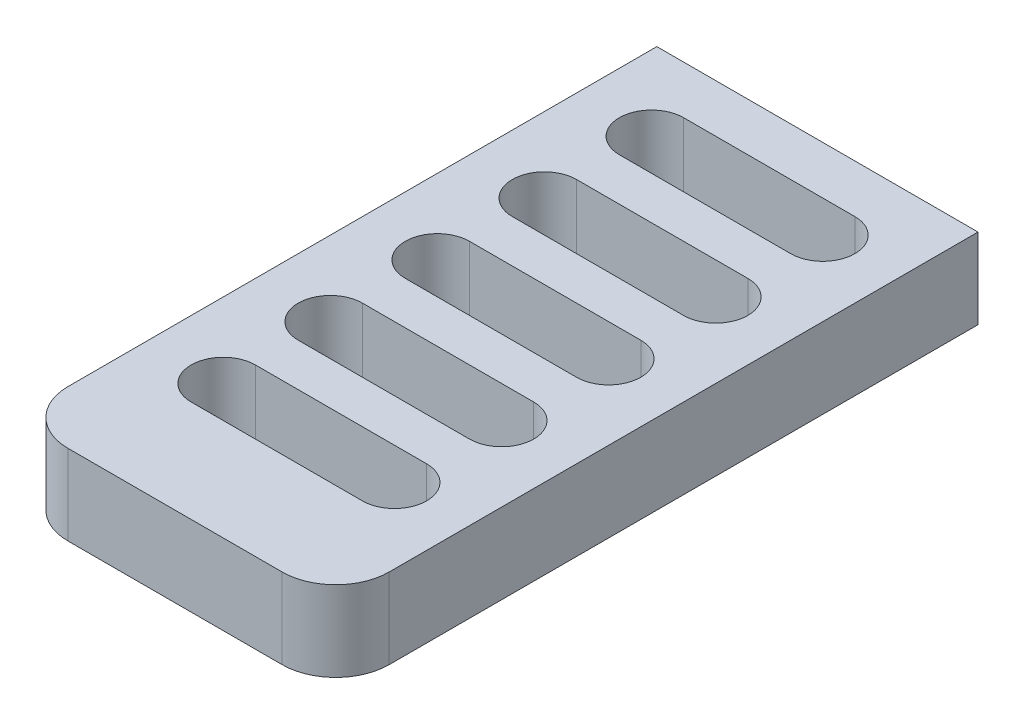
ISO-10303-21;
HEADER;
FILE_DESCRIPTION(('STEP AP214'),'2;1');
FILE_NAME('part.step','',(''),(''),'','','');
FILE_SCHEMA(('AUTOMOTIVE_DESIGN { 1 0 10303 214 1 1 1 1 }'));
ENDSEC;
DATA;
#1=APPLICATION_CONTEXT('core data for automotive mechanical design processes');
#2=APPLICATION_PROTOCOL_DEFINITION('international standard','automotive_design',2000,#1);
#3=PRODUCT_CONTEXT('',#1,'mechanical');
#4=PRODUCT('Part','Part','',(#3));
#5=PRODUCT_RELATED_PRODUCT_CATEGORY('part','',(#4));
#6=PRODUCT_DEFINITION_FORMATION('','',#4);
#7=PRODUCT_DEFINITION_CONTEXT('part definition',#1,'design');
#8=PRODUCT_DEFINITION('design','',#6,#7);
#9=PRODUCT_DEFINITION_SHAPE('','',#8);
#10=(LENGTH_UNIT() NAMED_UNIT(*) SI_UNIT(.MILLI.,.METRE.));
#11=(NAMED_UNIT(*) PLANE_ANGLE_UNIT() SI_UNIT($,.RADIAN.));
#12=(NAMED_UNIT(*) SI_UNIT($,.STERADIAN.) SOLID_ANGLE_UNIT());
#13=UNCERTAINTY_MEASURE_WITH_UNIT(LENGTH_MEASURE(1.E-05),#10,'distance_accuracy_value','');
#14=(GEOMETRIC_REPRESENTATION_CONTEXT(3) GLOBAL_UNCERTAINTY_ASSIGNED_CONTEXT((#13)) GLOBAL_UNIT_ASSIGNED_CONTEXT((#10,
#11,#12)) REPRESENTATION_CONTEXT('',''));
#15=CARTESIAN_POINT('',(0.,0.,0.));
#16=DIRECTION('',(0.,0.,1.));
#17=DIRECTION('',(1.,0.,0.));
#18=AXIS2_PLACEMENT_3D('',#15,#16,#17);
#19=CARTESIAN_POINT('',(10.,15.,-10.));
#20=DIRECTION('',(0.,-1.,0.));
#21=DIRECTION('',(0.,0.,-1.));
#22=AXIS2_PLACEMENT_3D('',#19,#20,#21);
#23=PLANE('',#22);
#24=CARTESIAN_POINT('',(14.,15.,-45.));
#25=DIRECTION('',(0.,1.,0.));
#26=DIRECTION('',(0.,0.,1.));
#27=AXIS2_PLACEMENT_3D('',#24,#25,#26);
#28=CIRCLE('',#27,6.00000000000001);
#29=CARTESIAN_POINT('',(14.,15.,-51.));
#30=VERTEX_POINT('',#29);
#31=CARTESIAN_POINT('',(14.,15.,-39.));
#32=VERTEX_POINT('',#31);
#33=EDGE_CURVE('E246',#30,#32,#28,.T.);
#34=ORIENTED_EDGE('',*,*,#33,.F.);
#35=DIRECTION('',(-1.,0.,0.));
#36=VECTOR('',#35,1.);
#37=CARTESIAN_POINT('',(14.,15.,-51.));
#38=LINE('',#37,#36);
#39=CARTESIAN_POINT('',(46.,15.,-51.));
#40=VERTEX_POINT('',#39);
#41=EDGE_CURVE('E254',#40,#30,#38,.T.);
#42=ORIENTED_EDGE('',*,*,#41,.F.);
#43=CARTESIAN_POINT('',(46.,15.,-45.));
#44=DIRECTION('',(0.,1.,0.));
#45=DIRECTION('',(0.,0.,1.));
#46=AXIS2_PLACEMENT_3D('',#43,#44,#45);
#47=CIRCLE('',#46,6.00000000000001);
#48=CARTESIAN_POINT('',(46.,15.,-39.));
#49=VERTEX_POINT('',#48);
#50=EDGE_CURVE('E251',#49,#40,#47,.T.);
#51=ORIENTED_EDGE('',*,*,#50,.F.);
#52=DIRECTION('',(1.,0.,0.));
#53=VECTOR('',#52,1.);
#54=CARTESIAN_POINT('',(14.,15.,-39.));
#55=LINE('',#54,#53);
#56=EDGE_CURVE('E248',#32,#49,#55,.T.);
#57=ORIENTED_EDGE('',*,*,#56,.F.);
#58=EDGE_LOOP('',(#34,#42,#51,#57));
#59=FACE_BOUND('',#58,.T.);
#60=CARTESIAN_POINT('',(14.,15.,-85.));
#61=DIRECTION('',(0.,1.,0.));
#62=DIRECTION('',(0.,0.,1.));
#63=AXIS2_PLACEMENT_3D('',#60,#61,#62);
#64=CIRCLE('',#63,6.00000000000001);
#65=CARTESIAN_POINT('',(14.,15.,-91.));
#66=VERTEX_POINT('',#65);
#67=CARTESIAN_POINT('',(14.,15.,-79.));
#68=VERTEX_POINT('',#67);
#69=EDGE_CURVE('E308',#66,#68,#64,.T.);
#70=ORIENTED_EDGE('',*,*,#69,.F.);
#71=DIRECTION('',(-1.,0.,0.));
#72=VECTOR('',#71,1.);
#73=CARTESIAN_POINT('',(14.,15.,-91.));
#74=LINE('',#73,#72);
#75=CARTESIAN_POINT('',(46.,15.,-91.));
#76=VERTEX_POINT('',#75);
#77=EDGE_CURVE('E316',#76,#66,#74,.T.);
#78=ORIENTED_EDGE('',*,*,#77,.F.);
#79=CARTESIAN_POINT('',(46.,15.,-85.));
#80=DIRECTION('',(0.,1.,0.));
#81=DIRECTION('',(0.,0.,1.));
#82=AXIS2_PLACEMENT_3D('',#79,#80,#81);
#83=CIRCLE('',#82,6.00000000000001);
#84=CARTESIAN_POINT('',(46.,15.,-79.));
#85=VERTEX_POINT('',#84);
#86=EDGE_CURVE('E313',#85,#76,#83,.T.);
#87=ORIENTED_EDGE('',*,*,#86,.F.);
#88=DIRECTION('',(1.,0.,0.));
#89=VECTOR('',#88,1.);
#90=CARTESIAN_POINT('',(14.,15.,-79.));
#91=LINE('',#90,#89);
#92=EDGE_CURVE('E310',#68,#85,#91,.T.);
#93=ORIENTED_EDGE('',*,*,#92,.F.);
#94=EDGE_LOOP('',(#70,#78,#87,#93));
#95=FACE_BOUND('',#94,.T.);
#96=DIRECTION('',(0.,0.,-1.));
#97=VECTOR('',#96,1.);
#98=CARTESIAN_POINT('',(60.,15.,-10.0000000000001));
#99=LINE('',#98,#97);
#100=CARTESIAN_POINT('',(60.,15.,-10.0000000000001));
#101=VERTEX_POINT('',#100);
#102=CARTESIAN_POINT('',(60.,15.,-120.));
#103=VERTEX_POINT('',#102);
#104=EDGE_CURVE('E370',#101,#103,#99,.T.);
#105=ORIENTED_EDGE('',*,*,#104,.T.);
#106=DIRECTION('',(-1.,0.,0.));
#107=VECTOR('',#106,1.);
#108=CARTESIAN_POINT('',(0.,15.,-120.));
#109=LINE('',#108,#107);
#110=CARTESIAN_POINT('',(0.,15.,-120.));
#111=VERTEX_POINT('',#110);
#112=EDGE_CURVE('E373',#103,#111,#109,.T.);
#113=ORIENTED_EDGE('',*,*,#112,.T.);
#114=DIRECTION('',(0.,0.,1.));
#115=VECTOR('',#114,1.);
#116=CARTESIAN_POINT('',(0.,15.,-10.0000000000001));
#117=LINE('',#116,#115);
#118=CARTESIAN_POINT('',(0.,15.,-10.0000000000001));
#119=VERTEX_POINT('',#118);
#120=EDGE_CURVE('E376',#111,#119,#117,.T.);
#121=ORIENTED_EDGE('',*,*,#120,.T.);
#122=CARTESIAN_POINT('',(10.,15.,-10.));
#123=DIRECTION('',(0.,1.,0.));
#124=DIRECTION('',(0.,0.,-1.));
#125=AXIS2_PLACEMENT_3D('',#122,#123,#124);
#126=CIRCLE('',#125,10.);
#127=CARTESIAN_POINT('',(10.0000000000001,15.,0.));
#128=VERTEX_POINT('',#127);
#129=EDGE_CURVE('E378',#119,#128,#126,.T.);
#130=ORIENTED_EDGE('',*,*,#129,.T.);
#131=DIRECTION('',(1.,0.,0.));
#132=VECTOR('',#131,1.);
#133=CARTESIAN_POINT('',(10.0000000000001,15.,0.));
#134=LINE('',#133,#132);
#135=CARTESIAN_POINT('',(49.9999999999999,15.,0.));
#136=VERTEX_POINT('',#135);
#137=EDGE_CURVE('E380',#128,#136,#134,.T.);
#138=ORIENTED_EDGE('',*,*,#137,.T.);
#139=CARTESIAN_POINT('',(50.,15.,-10.));
#140=DIRECTION('',(0.,1.,0.));
#141=DIRECTION('',(0.,0.,1.));
#142=AXIS2_PLACEMENT_3D('',#139,#140,#141);
#143=CIRCLE('',#142,10.);
#144=EDGE_CURVE('E382',#136,#101,#143,.T.);
#145=ORIENTED_EDGE('',*,*,#144,.T.);
#146=EDGE_LOOP('',(#105,#113,#121,#130,#138,#145));
#147=FACE_BOUND('',#146,.T.);
#148=CARTESIAN_POINT('',(14.,15.,-105.));
#149=DIRECTION('',(0.,1.,0.));
#150=DIRECTION('',(0.,0.,1.));
#151=AXIS2_PLACEMENT_3D('',#148,#149,#150);
#152=CIRCLE('',#151,6.00000000000001);
#153=CARTESIAN_POINT('',(14.,15.,-111.));
#154=VERTEX_POINT('',#153);
#155=CARTESIAN_POINT('',(14.,15.,-99.));
#156=VERTEX_POINT('',#155);
#157=EDGE_CURVE('E339',#154,#156,#152,.T.);
#158=ORIENTED_EDGE('',*,*,#157,.F.);
#159=DIRECTION('',(-1.,0.,0.));
#160=VECTOR('',#159,1.);
#161=CARTESIAN_POINT('',(14.,15.,-111.));
#162=LINE('',#161,#160);
#163=CARTESIAN_POINT('',(46.,15.,-111.));
#164=VERTEX_POINT('',#163);
#165=EDGE_CURVE('E347',#164,#154,#162,.T.);
#166=ORIENTED_EDGE('',*,*,#165,.F.);
#167=CARTESIAN_POINT('',(46.,15.,-105.));
#168=DIRECTION('',(0.,1.,0.));
#169=DIRECTION('',(0.,0.,1.));
#170=AXIS2_PLACEMENT_3D('',#167,#168,#169);
#171=CIRCLE('',#170,6.00000000000001);
#172=CARTESIAN_POINT('',(46.,15.,-99.));
#173=VERTEX_POINT('',#172);
#174=EDGE_CURVE('E344',#173,#164,#171,.T.);
#175=ORIENTED_EDGE('',*,*,#174,.F.);
#176=DIRECTION('',(1.,0.,0.));
#177=VECTOR('',#176,1.);
#178=CARTESIAN_POINT('',(14.,15.,-99.));
#179=LINE('',#178,#177);
#180=EDGE_CURVE('E341',#156,#173,#179,.T.);
#181=ORIENTED_EDGE('',*,*,#180,.F.);
#182=EDGE_LOOP('',(#158,#166,#175,#181));
#183=FACE_BOUND('',#182,.T.);
#184=CARTESIAN_POINT('',(14.,15.,-65.));
#185=DIRECTION('',(0.,1.,0.));
#186=DIRECTION('',(0.,0.,1.));
#187=AXIS2_PLACEMENT_3D('',#184,#185,#186);
#188=CIRCLE('',#187,6.00000000000001);
#189=CARTESIAN_POINT('',(14.,15.,-71.));
#190=VERTEX_POINT('',#189);
#191=CARTESIAN_POINT('',(14.,15.,-59.));
#192=VERTEX_POINT('',#191);
#193=EDGE_CURVE('E277',#190,#192,#188,.T.);
#194=ORIENTED_EDGE('',*,*,#193,.F.);
#195=DIRECTION('',(-1.,0.,0.));
#196=VECTOR('',#195,1.);
#197=CARTESIAN_POINT('',(14.,15.,-71.));
#198=LINE('',#197,#196);
#199=CARTESIAN_POINT('',(46.,15.,-71.));
#200=VERTEX_POINT('',#199);
#201=EDGE_CURVE('E285',#200,#190,#198,.T.);
#202=ORIENTED_EDGE('',*,*,#201,.F.);
#203=CARTESIAN_POINT('',(46.,15.,-65.));
#204=DIRECTION('',(0.,1.,0.));
#205=DIRECTION('',(0.,0.,1.));
#206=AXIS2_PLACEMENT_3D('',#203,#204,#205);
#207=CIRCLE('',#206,6.);
#208=CARTESIAN_POINT('',(46.,15.,-59.));
#209=VERTEX_POINT('',#208);
#210=EDGE_CURVE('E282',#209,#200,#207,.T.);
#211=ORIENTED_EDGE('',*,*,#210,.F.);
#212=DIRECTION('',(1.,0.,0.));
#213=VECTOR('',#212,1.);
#214=CARTESIAN_POINT('',(14.,15.,-59.));
#215=LINE('',#214,#213);
#216=EDGE_CURVE('E279',#192,#209,#215,.T.);
#217=ORIENTED_EDGE('',*,*,#216,.F.);
#218=EDGE_LOOP('',(#194,#202,#211,#217));
#219=FACE_BOUND('',#218,.T.);
#220=CARTESIAN_POINT('',(14.,15.,-25.));
#221=DIRECTION('',(0.,1.,0.));
#222=DIRECTION('',(0.,0.,1.));
#223=AXIS2_PLACEMENT_3D('',#220,#221,#222);
#224=CIRCLE('',#223,6.00000000000001);
#225=CARTESIAN_POINT('',(14.,15.,-31.));
#226=VERTEX_POINT('',#225);
#227=CARTESIAN_POINT('',(14.,15.,-19.));
#228=VERTEX_POINT('',#227);
#229=EDGE_CURVE('E210',#226,#228,#224,.T.);
#230=ORIENTED_EDGE('',*,*,#229,.F.);
#231=DIRECTION('',(-1.,0.,0.));
#232=VECTOR('',#231,1.);
#233=CARTESIAN_POINT('',(14.,15.,-31.));
#234=LINE('',#233,#232);
#235=CARTESIAN_POINT('',(46.,15.,-31.));
#236=VERTEX_POINT('',#235);
#237=EDGE_CURVE('E232',#236,#226,#234,.T.);
#238=ORIENTED_EDGE('',*,*,#237,.F.);
#239=CARTESIAN_POINT('',(46.,15.,-25.));
#240=DIRECTION('',(0.,1.,0.));
#241=DIRECTION('',(0.,0.,1.));
#242=AXIS2_PLACEMENT_3D('',#239,#240,#241);
#243=CIRCLE('',#242,6.00000000000001);
#244=CARTESIAN_POINT('',(46.,15.,-19.));
#245=VERTEX_POINT('',#244);
#246=EDGE_CURVE('E230',#245,#236,#243,.T.);
#247=ORIENTED_EDGE('',*,*,#246,.F.);
#248=DIRECTION('',(1.,0.,0.));
#249=VECTOR('',#248,1.);
#250=CARTESIAN_POINT('',(14.,15.,-19.));
#251=LINE('',#250,#249);
#252=EDGE_CURVE('E218',#228,#245,#251,.T.);
#253=ORIENTED_EDGE('',*,*,#252,.F.);
#254=EDGE_LOOP('',(#230,#238,#247,#253));
#255=FACE_BOUND('',#254,.T.);
#256=ADVANCED_FACE('F37',(#59,#95,#147,#183,#219,#255),#23,.F.);
#257=CARTESIAN_POINT('',(10.,0.,-10.));
#258=DIRECTION('',(0.,-1.,0.));
#259=DIRECTION('',(0.,0.,-1.));
#260=AXIS2_PLACEMENT_3D('',#257,#258,#259);
#261=PLANE('',#260);
#262=DIRECTION('',(0.,0.,-1.));
#263=VECTOR('',#262,1.);
#264=CARTESIAN_POINT('',(60.,0.,-10.0000000000001));
#265=LINE('',#264,#263);
#266=CARTESIAN_POINT('',(60.,0.,-10.0000000000001));
#267=VERTEX_POINT('',#266);
#268=CARTESIAN_POINT('',(60.,0.,-120.));
#269=VERTEX_POINT('',#268);
#270=EDGE_CURVE('E369',#267,#269,#265,.T.);
#271=ORIENTED_EDGE('',*,*,#270,.F.);
#272=CARTESIAN_POINT('',(50.,0.,-10.));
#273=DIRECTION('',(0.,1.,0.));
#274=DIRECTION('',(0.,0.,1.));
#275=AXIS2_PLACEMENT_3D('',#272,#273,#274);
#276=CIRCLE('',#275,10.);
#277=CARTESIAN_POINT('',(49.9999999999999,0.,0.));
#278=VERTEX_POINT('',#277);
#279=EDGE_CURVE('E374',#278,#267,#276,.T.);
#280=ORIENTED_EDGE('',*,*,#279,.F.);
#281=DIRECTION('',(1.,0.,0.));
#282=VECTOR('',#281,1.);
#283=CARTESIAN_POINT('',(10.0000000000001,0.,0.));
#284=LINE('',#283,#282);
#285=CARTESIAN_POINT('',(10.0000000000001,0.,0.));
#286=VERTEX_POINT('',#285);
#287=EDGE_CURVE('E393',#286,#278,#284,.T.);
#288=ORIENTED_EDGE('',*,*,#287,.F.);
#289=CARTESIAN_POINT('',(10.,0.,-10.));
#290=DIRECTION('',(0.,1.,0.));
#291=DIRECTION('',(0.,0.,-1.));
#292=AXIS2_PLACEMENT_3D('',#289,#290,#291);
#293=CIRCLE('',#292,10.);
#294=CARTESIAN_POINT('',(0.,0.,-10.0000000000001));
#295=VERTEX_POINT('',#294);
#296=EDGE_CURVE('E391',#295,#286,#293,.T.);
#297=ORIENTED_EDGE('',*,*,#296,.F.);
#298=DIRECTION('',(0.,0.,1.));
#299=VECTOR('',#298,1.);
#300=CARTESIAN_POINT('',(0.,0.,-10.0000000000001));
#301=LINE('',#300,#299);
#302=CARTESIAN_POINT('',(0.,0.,-120.));
#303=VERTEX_POINT('',#302);
#304=EDGE_CURVE('E389',#303,#295,#301,.T.);
#305=ORIENTED_EDGE('',*,*,#304,.F.);
#306=DIRECTION('',(-1.,0.,0.));
#307=VECTOR('',#306,1.);
#308=CARTESIAN_POINT('',(0.,0.,-120.));
#309=LINE('',#308,#307);
#310=EDGE_CURVE('E387',#269,#303,#309,.T.);
#311=ORIENTED_EDGE('',*,*,#310,.F.);
#312=EDGE_LOOP('',(#271,#280,#288,#297,#305,#311));
#313=FACE_BOUND('',#312,.T.);
#314=DIRECTION('',(-1.,0.,0.));
#315=VECTOR('',#314,1.);
#316=CARTESIAN_POINT('',(14.,0.,-111.));
#317=LINE('',#316,#315);
#318=CARTESIAN_POINT('',(46.,0.,-111.));
#319=VERTEX_POINT('',#318);
#320=CARTESIAN_POINT('',(14.,0.,-111.));
#321=VERTEX_POINT('',#320);
#322=EDGE_CURVE('E342',#319,#321,#317,.T.);
#323=ORIENTED_EDGE('',*,*,#322,.T.);
#324=CARTESIAN_POINT('',(14.,0.,-105.));
#325=DIRECTION('',(0.,1.,0.));
#326=DIRECTION('',(0.,0.,1.));
#327=AXIS2_PLACEMENT_3D('',#324,#325,#326);
#328=CIRCLE('',#327,6.00000000000001);
#329=CARTESIAN_POINT('',(14.,0.,-99.));
#330=VERTEX_POINT('',#329);
#331=EDGE_CURVE('E338',#321,#330,#328,.T.);
#332=ORIENTED_EDGE('',*,*,#331,.T.);
#333=DIRECTION('',(1.,0.,0.));
#334=VECTOR('',#333,1.);
#335=CARTESIAN_POINT('',(14.,0.,-99.));
#336=LINE('',#335,#334);
#337=CARTESIAN_POINT('',(46.,0.,-99.));
#338=VERTEX_POINT('',#337);
#339=EDGE_CURVE('E352',#330,#338,#336,.T.);
#340=ORIENTED_EDGE('',*,*,#339,.T.);
#341=CARTESIAN_POINT('',(46.,0.,-105.));
#342=DIRECTION('',(0.,1.,0.));
#343=DIRECTION('',(0.,0.,1.));
#344=AXIS2_PLACEMENT_3D('',#341,#342,#343);
#345=CIRCLE('',#344,6.00000000000001);
#346=EDGE_CURVE('E355',#338,#319,#345,.T.);
#347=ORIENTED_EDGE('',*,*,#346,.T.);
#348=EDGE_LOOP('',(#323,#332,#340,#347));
#349=FACE_BOUND('',#348,.T.);
#350=DIRECTION('',(-1.,0.,0.));
#351=VECTOR('',#350,1.);
#352=CARTESIAN_POINT('',(14.,0.,-91.));
#353=LINE('',#352,#351);
#354=CARTESIAN_POINT('',(46.,0.,-91.));
#355=VERTEX_POINT('',#354);
#356=CARTESIAN_POINT('',(14.,0.,-91.));
#357=VERTEX_POINT('',#356);
#358=EDGE_CURVE('E311',#355,#357,#353,.T.);
#359=ORIENTED_EDGE('',*,*,#358,.T.);
#360=CARTESIAN_POINT('',(14.,0.,-85.));
#361=DIRECTION('',(0.,1.,0.));
#362=DIRECTION('',(0.,0.,1.));
#363=AXIS2_PLACEMENT_3D('',#360,#361,#362);
#364=CIRCLE('',#363,6.00000000000001);
#365=CARTESIAN_POINT('',(14.,0.,-79.));
#366=VERTEX_POINT('',#365);
#367=EDGE_CURVE('E307',#357,#366,#364,.T.);
#368=ORIENTED_EDGE('',*,*,#367,.T.);
#369=DIRECTION('',(1.,0.,0.));
#370=VECTOR('',#369,1.);
#371=CARTESIAN_POINT('',(14.,0.,-79.));
#372=LINE('',#371,#370);
#373=CARTESIAN_POINT('',(46.,0.,-79.));
#374=VERTEX_POINT('',#373);
#375=EDGE_CURVE('E321',#366,#374,#372,.T.);
#376=ORIENTED_EDGE('',*,*,#375,.T.);
#377=CARTESIAN_POINT('',(46.,0.,-85.));
#378=DIRECTION('',(0.,1.,0.));
#379=DIRECTION('',(0.,0.,1.));
#380=AXIS2_PLACEMENT_3D('',#377,#378,#379);
#381=CIRCLE('',#380,6.00000000000001);
#382=EDGE_CURVE('E324',#374,#355,#381,.T.);
#383=ORIENTED_EDGE('',*,*,#382,.T.);
#384=EDGE_LOOP('',(#359,#368,#376,#383));
#385=FACE_BOUND('',#384,.T.);
#386=DIRECTION('',(-1.,0.,0.));
#387=VECTOR('',#386,1.);
#388=CARTESIAN_POINT('',(14.,0.,-71.));
#389=LINE('',#388,#387);
#390=CARTESIAN_POINT('',(46.,0.,-71.));
#391=VERTEX_POINT('',#390);
#392=CARTESIAN_POINT('',(14.,0.,-71.));
#393=VERTEX_POINT('',#392);
#394=EDGE_CURVE('E280',#391,#393,#389,.T.);
#395=ORIENTED_EDGE('',*,*,#394,.T.);
#396=CARTESIAN_POINT('',(14.,0.,-65.));
#397=DIRECTION('',(0.,1.,0.));
#398=DIRECTION('',(0.,0.,1.));
#399=AXIS2_PLACEMENT_3D('',#396,#397,#398);
#400=CIRCLE('',#399,6.00000000000001);
#401=CARTESIAN_POINT('',(14.,0.,-59.));
#402=VERTEX_POINT('',#401);
#403=EDGE_CURVE('E276',#393,#402,#400,.T.);
#404=ORIENTED_EDGE('',*,*,#403,.T.);
#405=DIRECTION('',(1.,0.,0.));
#406=VECTOR('',#405,1.);
#407=CARTESIAN_POINT('',(14.,0.,-59.));
#408=LINE('',#407,#406);
#409=CARTESIAN_POINT('',(46.,0.,-59.));
#410=VERTEX_POINT('',#409);
#411=EDGE_CURVE('E290',#402,#410,#408,.T.);
#412=ORIENTED_EDGE('',*,*,#411,.T.);
#413=CARTESIAN_POINT('',(46.,0.,-65.));
#414=DIRECTION('',(0.,1.,0.));
#415=DIRECTION('',(0.,0.,1.));
#416=AXIS2_PLACEMENT_3D('',#413,#414,#415);
#417=CIRCLE('',#416,6.);
#418=EDGE_CURVE('E293',#410,#391,#417,.T.);
#419=ORIENTED_EDGE('',*,*,#418,.T.);
#420=EDGE_LOOP('',(#395,#404,#412,#419));
#421=FACE_BOUND('',#420,.T.);
#422=DIRECTION('',(-1.,0.,0.));
#423=VECTOR('',#422,1.);
#424=CARTESIAN_POINT('',(14.,0.,-51.));
#425=LINE('',#424,#423);
#426=CARTESIAN_POINT('',(46.,0.,-51.));
#427=VERTEX_POINT('',#426);
#428=CARTESIAN_POINT('',(14.,0.,-51.));
#429=VERTEX_POINT('',#428);
#430=EDGE_CURVE('E249',#427,#429,#425,.T.);
#431=ORIENTED_EDGE('',*,*,#430,.T.);
#432=CARTESIAN_POINT('',(14.,0.,-45.));
#433=DIRECTION('',(0.,1.,0.));
#434=DIRECTION('',(0.,0.,1.));
#435=AXIS2_PLACEMENT_3D('',#432,#433,#434);
#436=CIRCLE('',#435,6.00000000000001);
#437=CARTESIAN_POINT('',(14.,0.,-39.));
#438=VERTEX_POINT('',#437);
#439=EDGE_CURVE('E226',#429,#438,#436,.T.);
#440=ORIENTED_EDGE('',*,*,#439,.T.);
#441=DIRECTION('',(1.,0.,0.));
#442=VECTOR('',#441,1.);
#443=CARTESIAN_POINT('',(14.,0.,-39.));
#444=LINE('',#443,#442);
#445=CARTESIAN_POINT('',(46.,0.,-39.));
#446=VERTEX_POINT('',#445);
#447=EDGE_CURVE('E259',#438,#446,#444,.T.);
#448=ORIENTED_EDGE('',*,*,#447,.T.);
#449=CARTESIAN_POINT('',(46.,0.,-45.));
#450=DIRECTION('',(0.,1.,0.));
#451=DIRECTION('',(0.,0.,1.));
#452=AXIS2_PLACEMENT_3D('',#449,#450,#451);
#453=CIRCLE('',#452,6.00000000000001);
#454=EDGE_CURVE('E262',#446,#427,#453,.T.);
#455=ORIENTED_EDGE('',*,*,#454,.T.);
#456=EDGE_LOOP('',(#431,#440,#448,#455));
#457=FACE_BOUND('',#456,.T.);
#458=DIRECTION('',(-1.,0.,0.));
#459=VECTOR('',#458,1.);
#460=CARTESIAN_POINT('',(14.,0.,-31.));
#461=LINE('',#460,#459);
#462=CARTESIAN_POINT('',(46.,0.,-31.));
#463=VERTEX_POINT('',#462);
#464=CARTESIAN_POINT('',(14.,0.,-31.));
#465=VERTEX_POINT('',#464);
#466=EDGE_CURVE('E219',#463,#465,#461,.T.);
#467=ORIENTED_EDGE('',*,*,#466,.T.);
#468=CARTESIAN_POINT('',(14.,0.,-25.));
#469=DIRECTION('',(0.,1.,0.));
#470=DIRECTION('',(0.,0.,1.));
#471=AXIS2_PLACEMENT_3D('',#468,#469,#470);
#472=CIRCLE('',#471,6.00000000000001);
#473=CARTESIAN_POINT('',(14.,0.,-19.));
#474=VERTEX_POINT('',#473);
#475=EDGE_CURVE('E60',#465,#474,#472,.T.);
#476=ORIENTED_EDGE('',*,*,#475,.T.);
#477=DIRECTION('',(1.,0.,0.));
#478=VECTOR('',#477,1.);
#479=CARTESIAN_POINT('',(14.,0.,-19.));
#480=LINE('',#479,#478);
#481=CARTESIAN_POINT('',(46.,0.,-19.));
#482=VERTEX_POINT('',#481);
#483=EDGE_CURVE('E225',#474,#482,#480,.T.);
#484=ORIENTED_EDGE('',*,*,#483,.T.);
#485=CARTESIAN_POINT('',(46.,0.,-25.));
#486=DIRECTION('',(0.,1.,0.));
#487=DIRECTION('',(0.,0.,1.));
#488=AXIS2_PLACEMENT_3D('',#485,#486,#487);
#489=CIRCLE('',#488,6.00000000000001);
#490=EDGE_CURVE('E238',#482,#463,#489,.T.);
#491=ORIENTED_EDGE('',*,*,#490,.T.);
#492=EDGE_LOOP('',(#467,#476,#484,#491));
#493=FACE_BOUND('',#492,.T.);
#494=ADVANCED_FACE('F417',(#313,#349,#385,#421,#457,#493),#261,.T.);
#495=CARTESIAN_POINT('',(60.,15.,-10.0000000000001));
#496=DIRECTION('',(-1.,0.,0.));
#497=DIRECTION('',(0.,0.,1.));
#498=AXIS2_PLACEMENT_3D('',#495,#496,#497);
#499=PLANE('',#498);
#500=ORIENTED_EDGE('',*,*,#270,.T.);
#501=DIRECTION('',(0.,-1.,0.));
#502=VECTOR('',#501,1.);
#503=CARTESIAN_POINT('',(60.,15.,-120.));
#504=LINE('',#503,#502);
#505=EDGE_CURVE('E11',#103,#269,#504,.T.);
#506=ORIENTED_EDGE('',*,*,#505,.F.);
#507=ORIENTED_EDGE('',*,*,#104,.F.);
#508=DIRECTION('',(0.,-1.,0.));
#509=VECTOR('',#508,1.);
#510=CARTESIAN_POINT('',(60.,15.,-10.0000000000001));
#511=LINE('',#510,#509);
#512=EDGE_CURVE('E384',#101,#267,#511,.T.);
#513=ORIENTED_EDGE('',*,*,#512,.T.);
#514=EDGE_LOOP('',(#500,#506,#507,#513));
#515=FACE_BOUND('',#514,.T.);
#516=ADVANCED_FACE('F39',(#515),#499,.F.);
#517=CARTESIAN_POINT('',(0.,15.,-120.));
#518=DIRECTION('',(0.,0.,1.));
#519=DIRECTION('',(1.,0.,0.));
#520=AXIS2_PLACEMENT_3D('',#517,#518,#519);
#521=PLANE('',#520);
#522=ORIENTED_EDGE('',*,*,#310,.T.);
#523=DIRECTION('',(0.,-1.,0.));
#524=VECTOR('',#523,1.);
#525=CARTESIAN_POINT('',(0.,15.,-120.));
#526=LINE('',#525,#524);
#527=EDGE_CURVE('E45',#111,#303,#526,.T.);
#528=ORIENTED_EDGE('',*,*,#527,.F.);
#529=ORIENTED_EDGE('',*,*,#112,.F.);
#530=ORIENTED_EDGE('',*,*,#505,.T.);
#531=EDGE_LOOP('',(#522,#528,#529,#530));
#532=FACE_BOUND('',#531,.T.);
#533=ADVANCED_FACE('F435',(#532),#521,.F.);
#534=CARTESIAN_POINT('',(0.,15.,-10.0000000000001));
#535=DIRECTION('',(1.,0.,0.));
#536=DIRECTION('',(0.,0.,-1.));
#537=AXIS2_PLACEMENT_3D('',#534,#535,#536);
#538=PLANE('',#537);
#539=ORIENTED_EDGE('',*,*,#304,.T.);
#540=DIRECTION('',(0.,-1.,0.));
#541=VECTOR('',#540,1.);
#542=CARTESIAN_POINT('',(0.,15.,-10.0000000000001));
#543=LINE('',#542,#541);
#544=EDGE_CURVE('E404',#119,#295,#543,.T.);
#545=ORIENTED_EDGE('',*,*,#544,.F.);
#546=ORIENTED_EDGE('',*,*,#120,.F.);
#547=ORIENTED_EDGE('',*,*,#527,.T.);
#548=EDGE_LOOP('',(#539,#545,#546,#547));
#549=FACE_BOUND('',#548,.T.);
#550=ADVANCED_FACE('F411',(#549),#538,.F.);
#551=CARTESIAN_POINT('',(10.,15.,-10.));
#552=DIRECTION('',(0.,-1.,0.));
#553=DIRECTION('',(0.,0.,-1.));
#554=AXIS2_PLACEMENT_3D('',#551,#552,#553);
#555=CYLINDRICAL_SURFACE('',#554,10.);
#556=ORIENTED_EDGE('',*,*,#296,.T.);
#557=DIRECTION('',(0.,-1.,0.));
#558=VECTOR('',#557,1.);
#559=CARTESIAN_POINT('',(10.0000000000001,15.,0.));
#560=LINE('',#559,#558);
#561=EDGE_CURVE('E401',#128,#286,#560,.T.);
#562=ORIENTED_EDGE('',*,*,#561,.F.);
#563=ORIENTED_EDGE('',*,*,#129,.F.);
#564=ORIENTED_EDGE('',*,*,#544,.T.);
#565=EDGE_LOOP('',(#556,#562,#563,#564));
#566=FACE_BOUND('',#565,.T.);
#567=ADVANCED_FACE('F423',(#566),#555,.T.);
#568=CARTESIAN_POINT('',(10.0000000000001,15.,0.));
#569=DIRECTION('',(0.,0.,-1.));
#570=DIRECTION('',(-1.,0.,0.));
#571=AXIS2_PLACEMENT_3D('',#568,#569,#570);
#572=PLANE('',#571);
#573=ORIENTED_EDGE('',*,*,#287,.T.);
#574=DIRECTION('',(0.,-1.,0.));
#575=VECTOR('',#574,1.);
#576=CARTESIAN_POINT('',(49.9999999999999,15.,0.));
#577=LINE('',#576,#575);
#578=EDGE_CURVE('E398',#136,#278,#577,.T.);
#579=ORIENTED_EDGE('',*,*,#578,.F.);
#580=ORIENTED_EDGE('',*,*,#137,.F.);
#581=ORIENTED_EDGE('',*,*,#561,.T.);
#582=EDGE_LOOP('',(#573,#579,#580,#581));
#583=FACE_BOUND('',#582,.T.);
#584=ADVANCED_FACE('F427',(#583),#572,.F.);
#585=CARTESIAN_POINT('',(50.,15.,-10.));
#586=DIRECTION('',(0.,-1.,0.));
#587=DIRECTION('',(0.,0.,-1.));
#588=AXIS2_PLACEMENT_3D('',#585,#586,#587);
#589=CYLINDRICAL_SURFACE('',#588,10.);
#590=ORIENTED_EDGE('',*,*,#279,.T.);
#591=ORIENTED_EDGE('',*,*,#512,.F.);
#592=ORIENTED_EDGE('',*,*,#144,.F.);
#593=ORIENTED_EDGE('',*,*,#578,.T.);
#594=EDGE_LOOP('',(#590,#591,#592,#593));
#595=FACE_BOUND('',#594,.T.);
#596=ADVANCED_FACE('F438',(#595),#589,.T.);
#597=CARTESIAN_POINT('',(14.,15.,-105.));
#598=DIRECTION('',(0.,-1.,0.));
#599=DIRECTION('',(0.,0.,-1.));
#600=AXIS2_PLACEMENT_3D('',#597,#598,#599);
#601=CYLINDRICAL_SURFACE('',#600,6.00000000000001);
#602=ORIENTED_EDGE('',*,*,#331,.F.);
#603=DIRECTION('',(0.,-1.,0.));
#604=VECTOR('',#603,1.);
#605=CARTESIAN_POINT('',(14.,15.,-111.));
#606=LINE('',#605,#604);
#607=EDGE_CURVE('E349',#154,#321,#606,.T.);
#608=ORIENTED_EDGE('',*,*,#607,.F.);
#609=ORIENTED_EDGE('',*,*,#157,.T.);
#610=DIRECTION('',(0.,-1.,0.));
#611=VECTOR('',#610,1.);
#612=CARTESIAN_POINT('',(14.,15.,-99.));
#613=LINE('',#612,#611);
#614=EDGE_CURVE('E366',#156,#330,#613,.T.);
#615=ORIENTED_EDGE('',*,*,#614,.T.);
#616=EDGE_LOOP('',(#602,#608,#609,#615));
#617=FACE_BOUND('',#616,.T.);
#618=ADVANCED_FACE('F440',(#617),#601,.F.);
#619=CARTESIAN_POINT('',(14.,15.,-99.));
#620=DIRECTION('',(0.,0.,-1.));
#621=DIRECTION('',(-1.,0.,0.));
#622=AXIS2_PLACEMENT_3D('',#619,#620,#621);
#623=PLANE('',#622);
#624=ORIENTED_EDGE('',*,*,#339,.F.);
#625=ORIENTED_EDGE('',*,*,#614,.F.);
#626=ORIENTED_EDGE('',*,*,#180,.T.);
#627=DIRECTION('',(0.,-1.,0.));
#628=VECTOR('',#627,1.);
#629=CARTESIAN_POINT('',(46.,15.,-99.));
#630=LINE('',#629,#628);
#631=EDGE_CURVE('E364',#173,#338,#630,.T.);
#632=ORIENTED_EDGE('',*,*,#631,.T.);
#633=EDGE_LOOP('',(#624,#625,#626,#632));
#634=FACE_BOUND('',#633,.T.);
#635=ADVANCED_FACE('F446',(#634),#623,.T.);
#636=CARTESIAN_POINT('',(46.,15.,-105.));
#637=DIRECTION('',(0.,-1.,0.));
#638=DIRECTION('',(0.,0.,-1.));
#639=AXIS2_PLACEMENT_3D('',#636,#637,#638);
#640=CYLINDRICAL_SURFACE('',#639,6.00000000000001);
#641=ORIENTED_EDGE('',*,*,#346,.F.);
#642=ORIENTED_EDGE('',*,*,#631,.F.);
#643=ORIENTED_EDGE('',*,*,#174,.T.);
#644=DIRECTION('',(0.,-1.,0.));
#645=VECTOR('',#644,1.);
#646=CARTESIAN_POINT('',(46.,15.,-111.));
#647=LINE('',#646,#645);
#648=EDGE_CURVE('E362',#164,#319,#647,.T.);
#649=ORIENTED_EDGE('',*,*,#648,.T.);
#650=EDGE_LOOP('',(#641,#642,#643,#649));
#651=FACE_BOUND('',#650,.T.);
#652=ADVANCED_FACE('F462',(#651),#640,.F.);
#653=CARTESIAN_POINT('',(14.,15.,-111.));
#654=DIRECTION('',(0.,0.,1.));
#655=DIRECTION('',(1.,0.,0.));
#656=AXIS2_PLACEMENT_3D('',#653,#654,#655);
#657=PLANE('',#656);
#658=ORIENTED_EDGE('',*,*,#322,.F.);
#659=ORIENTED_EDGE('',*,*,#648,.F.);
#660=ORIENTED_EDGE('',*,*,#165,.T.);
#661=ORIENTED_EDGE('',*,*,#607,.T.);
#662=EDGE_LOOP('',(#658,#659,#660,#661));
#663=FACE_BOUND('',#662,.T.);
#664=ADVANCED_FACE('F466',(#663),#657,.T.);
#665=CARTESIAN_POINT('',(14.,15.,-85.));
#666=DIRECTION('',(0.,-1.,0.));
#667=DIRECTION('',(0.,0.,-1.));
#668=AXIS2_PLACEMENT_3D('',#665,#666,#667);
#669=CYLINDRICAL_SURFACE('',#668,6.00000000000001);
#670=ORIENTED_EDGE('',*,*,#367,.F.);
#671=DIRECTION('',(0.,-1.,0.));
#672=VECTOR('',#671,1.);
#673=CARTESIAN_POINT('',(14.,15.,-91.));
#674=LINE('',#673,#672);
#675=EDGE_CURVE('E318',#66,#357,#674,.T.);
#676=ORIENTED_EDGE('',*,*,#675,.F.);
#677=ORIENTED_EDGE('',*,*,#69,.T.);
#678=DIRECTION('',(0.,-1.,0.));
#679=VECTOR('',#678,1.);
#680=CARTESIAN_POINT('',(14.,15.,-79.));
#681=LINE('',#680,#679);
#682=EDGE_CURVE('E335',#68,#366,#681,.T.);
#683=ORIENTED_EDGE('',*,*,#682,.T.);
#684=EDGE_LOOP('',(#670,#676,#677,#683));
#685=FACE_BOUND('',#684,.T.);
#686=ADVANCED_FACE('F470',(#685),#669,.F.);
#687=CARTESIAN_POINT('',(14.,15.,-79.));
#688=DIRECTION('',(0.,0.,-1.));
#689=DIRECTION('',(-1.,0.,0.));
#690=AXIS2_PLACEMENT_3D('',#687,#688,#689);
#691=PLANE('',#690);
#692=ORIENTED_EDGE('',*,*,#375,.F.);
#693=ORIENTED_EDGE('',*,*,#682,.F.);
#694=ORIENTED_EDGE('',*,*,#92,.T.);
#695=DIRECTION('',(0.,-1.,0.));
#696=VECTOR('',#695,1.);
#697=CARTESIAN_POINT('',(46.,15.,-79.));
#698=LINE('',#697,#696);
#699=EDGE_CURVE('E333',#85,#374,#698,.T.);
#700=ORIENTED_EDGE('',*,*,#699,.T.);
#701=EDGE_LOOP('',(#692,#693,#694,#700));
#702=FACE_BOUND('',#701,.T.);
#703=ADVANCED_FACE('F474',(#702),#691,.T.);
#704=CARTESIAN_POINT('',(46.,15.,-85.));
#705=DIRECTION('',(0.,-1.,0.));
#706=DIRECTION('',(0.,0.,-1.));
#707=AXIS2_PLACEMENT_3D('',#704,#705,#706);
#708=CYLINDRICAL_SURFACE('',#707,6.00000000000001);
#709=ORIENTED_EDGE('',*,*,#382,.F.);
#710=ORIENTED_EDGE('',*,*,#699,.F.);
#711=ORIENTED_EDGE('',*,*,#86,.T.);
#712=DIRECTION('',(0.,-1.,0.));
#713=VECTOR('',#712,1.);
#714=CARTESIAN_POINT('',(46.,15.,-91.));
#715=LINE('',#714,#713);
#716=EDGE_CURVE('E331',#76,#355,#715,.T.);
#717=ORIENTED_EDGE('',*,*,#716,.T.);
#718=EDGE_LOOP('',(#709,#710,#711,#717));
#719=FACE_BOUND('',#718,.T.);
#720=ADVANCED_FACE('F478',(#719),#708,.F.);
#721=CARTESIAN_POINT('',(14.,15.,-91.));
#722=DIRECTION('',(0.,0.,1.));
#723=DIRECTION('',(1.,0.,0.));
#724=AXIS2_PLACEMENT_3D('',#721,#722,#723);
#725=PLANE('',#724);
#726=ORIENTED_EDGE('',*,*,#358,.F.);
#727=ORIENTED_EDGE('',*,*,#716,.F.);
#728=ORIENTED_EDGE('',*,*,#77,.T.);
#729=ORIENTED_EDGE('',*,*,#675,.T.);
#730=EDGE_LOOP('',(#726,#727,#728,#729));
#731=FACE_BOUND('',#730,.T.);
#732=ADVANCED_FACE('F482',(#731),#725,.T.);
#733=CARTESIAN_POINT('',(14.,15.,-65.));
#734=DIRECTION('',(0.,-1.,0.));
#735=DIRECTION('',(0.,0.,-1.));
#736=AXIS2_PLACEMENT_3D('',#733,#734,#735);
#737=CYLINDRICAL_SURFACE('',#736,6.00000000000001);
#738=ORIENTED_EDGE('',*,*,#403,.F.);
#739=DIRECTION('',(0.,-1.,0.));
#740=VECTOR('',#739,1.);
#741=CARTESIAN_POINT('',(14.,15.,-71.));
#742=LINE('',#741,#740);
#743=EDGE_CURVE('E287',#190,#393,#742,.T.);
#744=ORIENTED_EDGE('',*,*,#743,.F.);
#745=ORIENTED_EDGE('',*,*,#193,.T.);
#746=DIRECTION('',(0.,-1.,0.));
#747=VECTOR('',#746,1.);
#748=CARTESIAN_POINT('',(14.,15.,-59.));
#749=LINE('',#748,#747);
#750=EDGE_CURVE('E304',#192,#402,#749,.T.);
#751=ORIENTED_EDGE('',*,*,#750,.T.);
#752=EDGE_LOOP('',(#738,#744,#745,#751));
#753=FACE_BOUND('',#752,.T.);
#754=ADVANCED_FACE('F486',(#753),#737,.F.);
#755=CARTESIAN_POINT('',(14.,15.,-59.));
#756=DIRECTION('',(0.,0.,-1.));
#757=DIRECTION('',(-1.,0.,0.));
#758=AXIS2_PLACEMENT_3D('',#755,#756,#757);
#759=PLANE('',#758);
#760=ORIENTED_EDGE('',*,*,#411,.F.);
#761=ORIENTED_EDGE('',*,*,#750,.F.);
#762=ORIENTED_EDGE('',*,*,#216,.T.);
#763=DIRECTION('',(0.,-1.,0.));
#764=VECTOR('',#763,1.);
#765=CARTESIAN_POINT('',(46.,15.,-59.));
#766=LINE('',#765,#764);
#767=EDGE_CURVE('E302',#209,#410,#766,.T.);
#768=ORIENTED_EDGE('',*,*,#767,.T.);
#769=EDGE_LOOP('',(#760,#761,#762,#768));
#770=FACE_BOUND('',#769,.T.);
#771=ADVANCED_FACE('F490',(#770),#759,.T.);
#772=CARTESIAN_POINT('',(46.,15.,-65.));
#773=DIRECTION('',(0.,-1.,0.));
#774=DIRECTION('',(0.,0.,-1.));
#775=AXIS2_PLACEMENT_3D('',#772,#773,#774);
#776=CYLINDRICAL_SURFACE('',#775,6.);
#777=ORIENTED_EDGE('',*,*,#418,.F.);
#778=ORIENTED_EDGE('',*,*,#767,.F.);
#779=ORIENTED_EDGE('',*,*,#210,.T.);
#780=DIRECTION('',(0.,-1.,0.));
#781=VECTOR('',#780,1.);
#782=CARTESIAN_POINT('',(46.,15.,-71.));
#783=LINE('',#782,#781);
#784=EDGE_CURVE('E300',#200,#391,#783,.T.);
#785=ORIENTED_EDGE('',*,*,#784,.T.);
#786=EDGE_LOOP('',(#777,#778,#779,#785));
#787=FACE_BOUND('',#786,.T.);
#788=ADVANCED_FACE('F494',(#787),#776,.F.);
#789=CARTESIAN_POINT('',(14.,15.,-71.));
#790=DIRECTION('',(0.,0.,1.));
#791=DIRECTION('',(1.,0.,0.));
#792=AXIS2_PLACEMENT_3D('',#789,#790,#791);
#793=PLANE('',#792);
#794=ORIENTED_EDGE('',*,*,#394,.F.);
#795=ORIENTED_EDGE('',*,*,#784,.F.);
#796=ORIENTED_EDGE('',*,*,#201,.T.);
#797=ORIENTED_EDGE('',*,*,#743,.T.);
#798=EDGE_LOOP('',(#794,#795,#796,#797));
#799=FACE_BOUND('',#798,.T.);
#800=ADVANCED_FACE('F498',(#799),#793,.T.);
#801=CARTESIAN_POINT('',(14.,15.,-45.));
#802=DIRECTION('',(0.,-1.,0.));
#803=DIRECTION('',(0.,0.,-1.));
#804=AXIS2_PLACEMENT_3D('',#801,#802,#803);
#805=CYLINDRICAL_SURFACE('',#804,6.00000000000001);
#806=ORIENTED_EDGE('',*,*,#439,.F.);
#807=DIRECTION('',(0.,-1.,0.));
#808=VECTOR('',#807,1.);
#809=CARTESIAN_POINT('',(14.,15.,-51.));
#810=LINE('',#809,#808);
#811=EDGE_CURVE('E256',#30,#429,#810,.T.);
#812=ORIENTED_EDGE('',*,*,#811,.F.);
#813=ORIENTED_EDGE('',*,*,#33,.T.);
#814=DIRECTION('',(0.,-1.,0.));
#815=VECTOR('',#814,1.);
#816=CARTESIAN_POINT('',(14.,15.,-39.));
#817=LINE('',#816,#815);
#818=EDGE_CURVE('E273',#32,#438,#817,.T.);
#819=ORIENTED_EDGE('',*,*,#818,.T.);
#820=EDGE_LOOP('',(#806,#812,#813,#819));
#821=FACE_BOUND('',#820,.T.);
#822=ADVANCED_FACE('F502',(#821),#805,.F.);
#823=CARTESIAN_POINT('',(14.,15.,-39.));
#824=DIRECTION('',(0.,0.,-1.));
#825=DIRECTION('',(-1.,0.,0.));
#826=AXIS2_PLACEMENT_3D('',#823,#824,#825);
#827=PLANE('',#826);
#828=ORIENTED_EDGE('',*,*,#447,.F.);
#829=ORIENTED_EDGE('',*,*,#818,.F.);
#830=ORIENTED_EDGE('',*,*,#56,.T.);
#831=DIRECTION('',(0.,-1.,0.));
#832=VECTOR('',#831,1.);
#833=CARTESIAN_POINT('',(46.,15.,-39.));
#834=LINE('',#833,#832);
#835=EDGE_CURVE('E271',#49,#446,#834,.T.);
#836=ORIENTED_EDGE('',*,*,#835,.T.);
#837=EDGE_LOOP('',(#828,#829,#830,#836));
#838=FACE_BOUND('',#837,.T.);
#839=ADVANCED_FACE('F506',(#838),#827,.T.);
#840=CARTESIAN_POINT('',(46.,15.,-45.));
#841=DIRECTION('',(0.,-1.,0.));
#842=DIRECTION('',(0.,0.,-1.));
#843=AXIS2_PLACEMENT_3D('',#840,#841,#842);
#844=CYLINDRICAL_SURFACE('',#843,6.00000000000001);
#845=ORIENTED_EDGE('',*,*,#454,.F.);
#846=ORIENTED_EDGE('',*,*,#835,.F.);
#847=ORIENTED_EDGE('',*,*,#50,.T.);
#848=DIRECTION('',(0.,-1.,0.));
#849=VECTOR('',#848,1.);
#850=CARTESIAN_POINT('',(46.,15.,-51.));
#851=LINE('',#850,#849);
#852=EDGE_CURVE('E269',#40,#427,#851,.T.);
#853=ORIENTED_EDGE('',*,*,#852,.T.);
#854=EDGE_LOOP('',(#845,#846,#847,#853));
#855=FACE_BOUND('',#854,.T.);
#856=ADVANCED_FACE('F510',(#855),#844,.F.);
#857=CARTESIAN_POINT('',(14.,15.,-51.));
#858=DIRECTION('',(0.,0.,1.));
#859=DIRECTION('',(1.,0.,0.));
#860=AXIS2_PLACEMENT_3D('',#857,#858,#859);
#861=PLANE('',#860);
#862=ORIENTED_EDGE('',*,*,#430,.F.);
#863=ORIENTED_EDGE('',*,*,#852,.F.);
#864=ORIENTED_EDGE('',*,*,#41,.T.);
#865=ORIENTED_EDGE('',*,*,#811,.T.);
#866=EDGE_LOOP('',(#862,#863,#864,#865));
#867=FACE_BOUND('',#866,.T.);
#868=ADVANCED_FACE('F514',(#867),#861,.T.);
#869=CARTESIAN_POINT('',(14.,15.,-25.));
#870=DIRECTION('',(0.,-1.,0.));
#871=DIRECTION('',(0.,0.,-1.));
#872=AXIS2_PLACEMENT_3D('',#869,#870,#871);
#873=CYLINDRICAL_SURFACE('',#872,6.00000000000001);
#874=ORIENTED_EDGE('',*,*,#475,.F.);
#875=DIRECTION('',(0.,-1.,0.));
#876=VECTOR('',#875,1.);
#877=CARTESIAN_POINT('',(14.,15.,-31.));
#878=LINE('',#877,#876);
#879=EDGE_CURVE('E214',#226,#465,#878,.T.);
#880=ORIENTED_EDGE('',*,*,#879,.F.);
#881=ORIENTED_EDGE('',*,*,#229,.T.);
#882=DIRECTION('',(0.,-1.,0.));
#883=VECTOR('',#882,1.);
#884=CARTESIAN_POINT('',(14.,15.,-19.));
#885=LINE('',#884,#883);
#886=EDGE_CURVE('E213',#228,#474,#885,.T.);
#887=ORIENTED_EDGE('',*,*,#886,.T.);
#888=EDGE_LOOP('',(#874,#880,#881,#887));
#889=FACE_BOUND('',#888,.T.);
#890=ADVANCED_FACE('F212',(#889),#873,.F.);
#891=CARTESIAN_POINT('',(14.,15.,-19.));
#892=DIRECTION('',(0.,0.,-1.));
#893=DIRECTION('',(-1.,0.,0.));
#894=AXIS2_PLACEMENT_3D('',#891,#892,#893);
#895=PLANE('',#894);
#896=ORIENTED_EDGE('',*,*,#483,.F.);
#897=ORIENTED_EDGE('',*,*,#886,.F.);
#898=ORIENTED_EDGE('',*,*,#252,.T.);
#899=DIRECTION('',(0.,-1.,0.));
#900=VECTOR('',#899,1.);
#901=CARTESIAN_POINT('',(46.,15.,-19.));
#902=LINE('',#901,#900);
#903=EDGE_CURVE('E227',#245,#482,#902,.T.);
#904=ORIENTED_EDGE('',*,*,#903,.T.);
#905=EDGE_LOOP('',(#896,#897,#898,#904));
#906=FACE_BOUND('',#905,.T.);
#907=ADVANCED_FACE('F222',(#906),#895,.T.);
#908=CARTESIAN_POINT('',(46.,15.,-25.));
#909=DIRECTION('',(0.,-1.,0.));
#910=DIRECTION('',(0.,0.,-1.));
#911=AXIS2_PLACEMENT_3D('',#908,#909,#910);
#912=CYLINDRICAL_SURFACE('',#911,6.00000000000001);
#913=ORIENTED_EDGE('',*,*,#490,.F.);
#914=ORIENTED_EDGE('',*,*,#903,.F.);
#915=ORIENTED_EDGE('',*,*,#246,.T.);
#916=DIRECTION('',(0.,-1.,0.));
#917=VECTOR('',#916,1.);
#918=CARTESIAN_POINT('',(46.,15.,-31.));
#919=LINE('',#918,#917);
#920=EDGE_CURVE('E52',#236,#463,#919,.T.);
#921=ORIENTED_EDGE('',*,*,#920,.T.);
#922=EDGE_LOOP('',(#913,#914,#915,#921));
#923=FACE_BOUND('',#922,.T.);
#924=ADVANCED_FACE('F523',(#923),#912,.F.);
#925=CARTESIAN_POINT('',(14.,15.,-31.));
#926=DIRECTION('',(0.,0.,1.));
#927=DIRECTION('',(1.,0.,0.));
#928=AXIS2_PLACEMENT_3D('',#925,#926,#927);
#929=PLANE('',#928);
#930=ORIENTED_EDGE('',*,*,#466,.F.);
#931=ORIENTED_EDGE('',*,*,#920,.F.);
#932=ORIENTED_EDGE('',*,*,#237,.T.);
#933=ORIENTED_EDGE('',*,*,#879,.T.);
#934=EDGE_LOOP('',(#930,#931,#932,#933));
#935=FACE_BOUND('',#934,.T.);
#936=ADVANCED_FACE('F526',(#935),#929,.T.);
#937=CLOSED_SHELL('',(#256,#494,#516,#533,#550,#567,#584,#596,#618,#635,#652,#664,#686,#703,
#720,#732,#754,#771,#788,#800,#822,#839,#856,#868,#890,#907,#924,#936));
#938=MANIFOLD_SOLID_BREP('B2',#937);
#939=ADVANCED_BREP_SHAPE_REPRESENTATION('',(#18,#938),#14);
#940=SHAPE_DEFINITION_REPRESENTATION(#9,#939);
ENDSEC;
END-ISO-10303-21;
